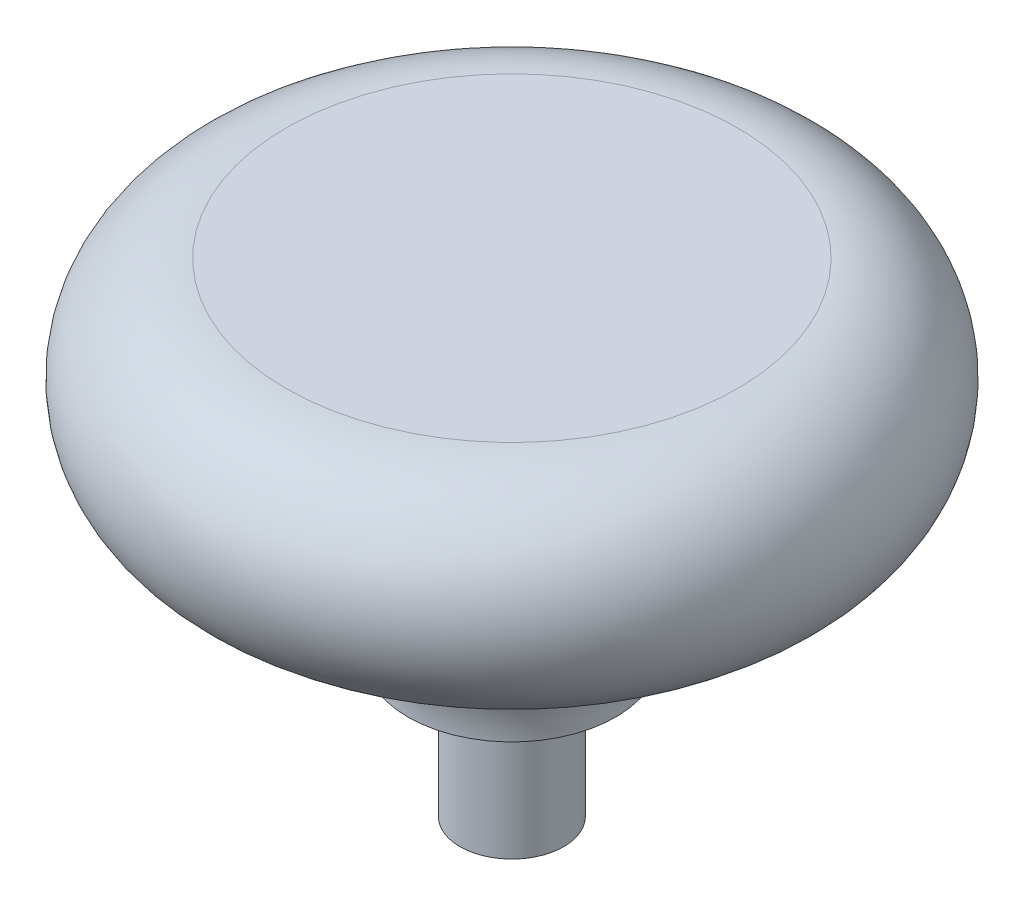
ISO-10303-21;
HEADER;
FILE_DESCRIPTION(('STEP AP214'),'2;1');
FILE_NAME('part.step','',(''),(''),'','','');
FILE_SCHEMA(('AUTOMOTIVE_DESIGN { 1 0 10303 214 1 1 1 1 }'));
ENDSEC;
DATA;
#1=APPLICATION_CONTEXT('core data for automotive mechanical design processes');
#2=APPLICATION_PROTOCOL_DEFINITION('international standard','automotive_design',2000,#1);
#3=PRODUCT_CONTEXT('',#1,'mechanical');
#4=PRODUCT('Part','Part','',(#3));
#5=PRODUCT_RELATED_PRODUCT_CATEGORY('part','',(#4));
#6=PRODUCT_DEFINITION_FORMATION('','',#4);
#7=PRODUCT_DEFINITION_CONTEXT('part definition',#1,'design');
#8=PRODUCT_DEFINITION('design','',#6,#7);
#9=PRODUCT_DEFINITION_SHAPE('','',#8);
#10=(LENGTH_UNIT() NAMED_UNIT(*) SI_UNIT(.MILLI.,.METRE.));
#11=(NAMED_UNIT(*) PLANE_ANGLE_UNIT() SI_UNIT($,.RADIAN.));
#12=(NAMED_UNIT(*) SI_UNIT($,.STERADIAN.) SOLID_ANGLE_UNIT());
#13=UNCERTAINTY_MEASURE_WITH_UNIT(LENGTH_MEASURE(1.E-05),#10,'distance_accuracy_value','');
#14=(GEOMETRIC_REPRESENTATION_CONTEXT(3) GLOBAL_UNCERTAINTY_ASSIGNED_CONTEXT((#13)) GLOBAL_UNIT_ASSIGNED_CONTEXT((#10,
#11,#12)) REPRESENTATION_CONTEXT('',''));
#15=CARTESIAN_POINT('',(0.,0.,0.));
#16=DIRECTION('',(0.,0.,1.));
#17=DIRECTION('',(1.,0.,0.));
#18=AXIS2_PLACEMENT_3D('',#15,#16,#17);
#19=CARTESIAN_POINT('',(0.,0.,0.));
#20=DIRECTION('',(0.,1.,0.));
#21=DIRECTION('',(0.,0.,1.));
#22=AXIS2_PLACEMENT_3D('',#19,#20,#21);
#23=CYLINDRICAL_SURFACE('',#22,2.3876);
#24=CARTESIAN_POINT('',(0.,0.,0.));
#25=DIRECTION('',(0.,1.,0.));
#26=DIRECTION('',(0.,0.,1.));
#27=AXIS2_PLACEMENT_3D('',#24,#25,#26);
#28=CIRCLE('',#27,2.3876);
#29=CARTESIAN_POINT('',(0.,0.,2.3876));
#30=VERTEX_POINT('',#29);
#31=EDGE_CURVE('E10',#30,#30,#28,.T.);
#32=ORIENTED_EDGE('',*,*,#31,.T.);
#33=EDGE_LOOP('',(#32));
#34=FACE_BOUND('',#33,.T.);
#35=CARTESIAN_POINT('',(0.,6.35,0.));
#36=DIRECTION('',(0.,1.,0.));
#37=DIRECTION('',(0.,0.,1.));
#38=AXIS2_PLACEMENT_3D('',#35,#36,#37);
#39=CIRCLE('',#38,2.3876);
#40=CARTESIAN_POINT('',(0.,6.35,2.3876));
#41=VERTEX_POINT('',#40);
#42=EDGE_CURVE('E49',#41,#41,#39,.T.);
#43=ORIENTED_EDGE('',*,*,#42,.F.);
#44=EDGE_LOOP('',(#43));
#45=FACE_BOUND('',#44,.T.);
#46=ADVANCED_FACE('F30',(#34,#45),#23,.T.);
#47=CARTESIAN_POINT('',(2.3876,0.,0.));
#48=DIRECTION('',(0.,-1.,0.));
#49=DIRECTION('',(0.,0.,-1.));
#50=AXIS2_PLACEMENT_3D('',#47,#48,#49);
#51=PLANE('',#50);
#52=ORIENTED_EDGE('',*,*,#31,.F.);
#53=EDGE_LOOP('',(#52));
#54=FACE_BOUND('',#53,.T.);
#55=ADVANCED_FACE('F57',(#54),#51,.T.);
#56=CARTESIAN_POINT('',(0.,22.225,0.));
#57=DIRECTION('',(0.,1.,0.));
#58=DIRECTION('',(0.,0.,1.));
#59=AXIS2_PLACEMENT_3D('',#56,#57,#58);
#60=PLANE('',#59);
#61=CARTESIAN_POINT('',(0.,22.225,0.));
#62=DIRECTION('',(0.,1.,0.));
#63=DIRECTION('',(0.,0.,1.));
#64=AXIS2_PLACEMENT_3D('',#61,#62,#63);
#65=CIRCLE('',#64,10.3738578675464);
#66=CARTESIAN_POINT('',(0.,22.225,10.3738578675464));
#67=VERTEX_POINT('',#66);
#68=EDGE_CURVE('E36',#67,#67,#65,.T.);
#69=ORIENTED_EDGE('',*,*,#68,.T.);
#70=EDGE_LOOP('',(#69));
#71=FACE_BOUND('',#70,.T.);
#72=ADVANCED_FACE('F61',(#71),#60,.T.);
#73=CARTESIAN_POINT('',(0.,17.4498,0.));
#74=DIRECTION('',(0.,1.,0.));
#75=DIRECTION('',(0.,0.,1.));
#76=AXIS2_PLACEMENT_3D('',#73,#74,#75);
#77=TOROIDAL_SURFACE('',#76,10.3738578675464,4.7752);
#78=CARTESIAN_POINT('',(0.,12.685502283105,0.));
#79=DIRECTION('',(0.,1.,0.));
#80=DIRECTION('',(0.,0.,1.));
#81=AXIS2_PLACEMENT_3D('',#78,#79,#80);
#82=CIRCLE('',#81,10.6963517508826);
#83=CARTESIAN_POINT('',(0.,12.685502283105,10.6963517508826));
#84=VERTEX_POINT('',#83);
#85=EDGE_CURVE('E40',#84,#84,#82,.T.);
#86=ORIENTED_EDGE('',*,*,#85,.T.);
#87=EDGE_LOOP('',(#86));
#88=FACE_BOUND('',#87,.T.);
#89=ORIENTED_EDGE('',*,*,#68,.F.);
#90=EDGE_LOOP('',(#89));
#91=FACE_BOUND('',#90,.T.);
#92=ADVANCED_FACE('F66',(#88,#91),#77,.T.);
#93=CARTESIAN_POINT('',(0.,6.35,0.));
#94=DIRECTION('',(0.,1.,0.));
#95=DIRECTION('',(0.,0.,1.));
#96=AXIS2_PLACEMENT_3D('',#93,#94,#95);
#97=TOROIDAL_SURFACE('',#96,11.1252,6.35);
#98=CARTESIAN_POINT('',(0.,6.35,0.));
#99=DIRECTION('',(0.,1.,0.));
#100=DIRECTION('',(0.,0.,1.));
#101=AXIS2_PLACEMENT_3D('',#98,#99,#100);
#102=CIRCLE('',#101,4.7752);
#103=CARTESIAN_POINT('',(0.,6.35,4.7752));
#104=VERTEX_POINT('',#103);
#105=EDGE_CURVE('E44',#104,#104,#102,.T.);
#106=ORIENTED_EDGE('',*,*,#105,.T.);
#107=EDGE_LOOP('',(#106));
#108=FACE_BOUND('',#107,.T.);
#109=ORIENTED_EDGE('',*,*,#85,.F.);
#110=EDGE_LOOP('',(#109));
#111=FACE_BOUND('',#110,.T.);
#112=ADVANCED_FACE('F71',(#108,#111),#97,.F.);
#113=CARTESIAN_POINT('',(4.7752,6.35,0.));
#114=DIRECTION('',(0.,-1.,0.));
#115=DIRECTION('',(0.,0.,-1.));
#116=AXIS2_PLACEMENT_3D('',#113,#114,#115);
#117=PLANE('',#116);
#118=ORIENTED_EDGE('',*,*,#42,.T.);
#119=EDGE_LOOP('',(#118));
#120=FACE_BOUND('',#119,.T.);
#121=ORIENTED_EDGE('',*,*,#105,.F.);
#122=EDGE_LOOP('',(#121));
#123=FACE_BOUND('',#122,.T.);
#124=ADVANCED_FACE('F53',(#120,#123),#117,.T.);
#125=CLOSED_SHELL('',(#46,#55,#72,#92,#112,#124));
#126=MANIFOLD_SOLID_BREP('B2',#125);
#127=ADVANCED_BREP_SHAPE_REPRESENTATION('',(#18,#126),#14);
#128=SHAPE_DEFINITION_REPRESENTATION(#9,#127);
ENDSEC;
END-ISO-10303-21;
